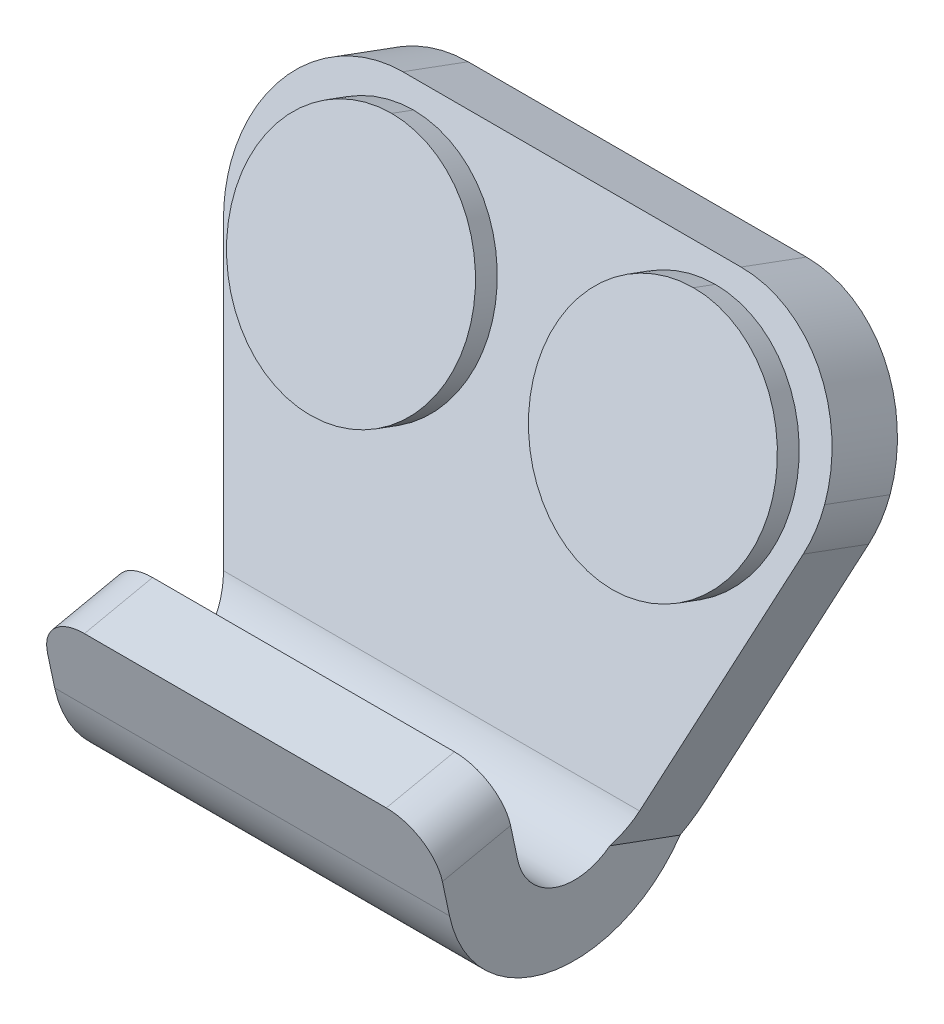
ISO-10303-21;
HEADER;
FILE_DESCRIPTION(('STEP AP214'),'2;1');
FILE_NAME('part.step','',(''),(''),'','','');
FILE_SCHEMA(('AUTOMOTIVE_DESIGN { 1 0 10303 214 1 1 1 1 }'));
ENDSEC;
DATA;
#1=APPLICATION_CONTEXT('core data for automotive mechanical design processes');
#2=APPLICATION_PROTOCOL_DEFINITION('international standard','automotive_design',2000,#1);
#3=PRODUCT_CONTEXT('',#1,'mechanical');
#4=PRODUCT('Part','Part','',(#3));
#5=PRODUCT_RELATED_PRODUCT_CATEGORY('part','',(#4));
#6=PRODUCT_DEFINITION_FORMATION('','',#4);
#7=PRODUCT_DEFINITION_CONTEXT('part definition',#1,'design');
#8=PRODUCT_DEFINITION('design','',#6,#7);
#9=PRODUCT_DEFINITION_SHAPE('','',#8);
#10=(LENGTH_UNIT() NAMED_UNIT(*) SI_UNIT(.MILLI.,.METRE.));
#11=(NAMED_UNIT(*) PLANE_ANGLE_UNIT() SI_UNIT($,.RADIAN.));
#12=(NAMED_UNIT(*) SI_UNIT($,.STERADIAN.) SOLID_ANGLE_UNIT());
#13=UNCERTAINTY_MEASURE_WITH_UNIT(LENGTH_MEASURE(1.E-05),#10,'distance_accuracy_value','');
#14=(GEOMETRIC_REPRESENTATION_CONTEXT(3) GLOBAL_UNCERTAINTY_ASSIGNED_CONTEXT((#13)) GLOBAL_UNIT_ASSIGNED_CONTEXT((#10,
#11,#12)) REPRESENTATION_CONTEXT('',''));
#15=CARTESIAN_POINT('',(0.,0.,0.));
#16=DIRECTION('',(0.,0.,1.));
#17=DIRECTION('',(1.,0.,0.));
#18=AXIS2_PLACEMENT_3D('',#15,#16,#17);
#19=CARTESIAN_POINT('',(-17.5228929671745,247.921551689117,306.539228223252));
#20=DIRECTION('',(0.,-0.345324030580384,-0.938483518184373));
#21=DIRECTION('',(0.,-0.938483518184373,0.345324030580384));
#22=AXIS2_PLACEMENT_3D('',#19,#20,#21);
#23=CYLINDRICAL_SURFACE('',#22,1.52002083154887);
#24=CARTESIAN_POINT('',(-17.5228929671745,247.921551689117,306.539228223252));
#25=DIRECTION('',(0.,0.345324030580384,0.938483518184373));
#26=DIRECTION('',(0.,0.938483518184373,-0.345324030580384));
#27=AXIS2_PLACEMENT_3D('',#24,#25,#26);
#28=CIRCLE('',#27,1.52002083154887);
#29=CARTESIAN_POINT('',(-17.5228929671745,249.348066186823,306.014328503135));
#30=VERTEX_POINT('',#29);
#31=CARTESIAN_POINT('',(-17.5228929671745,246.495037191412,307.064127943368));
#32=VERTEX_POINT('',#31);
#33=EDGE_CURVE('E63',#30,#32,#28,.T.);
#34=ORIENTED_EDGE('',*,*,#33,.F.);
#35=DIRECTION('',(0.,-0.345324030580384,-0.938483518184373));
#36=VECTOR('',#35,1.);
#37=CARTESIAN_POINT('',(-17.5228929671745,249.348066186823,306.014328503135));
#38=LINE('',#37,#36);
#39=CARTESIAN_POINT('',(-17.5228929671745,249.244468977648,305.73278344768));
#40=VERTEX_POINT('',#39);
#41=EDGE_CURVE('E11',#30,#40,#38,.T.);
#42=ORIENTED_EDGE('',*,*,#41,.T.);
#43=CARTESIAN_POINT('',(-17.5228929671745,247.817954479943,306.257683167796));
#44=DIRECTION('',(0.,0.345324030580384,0.938483518184373));
#45=DIRECTION('',(0.,0.938483518184373,-0.345324030580384));
#46=AXIS2_PLACEMENT_3D('',#43,#44,#45);
#47=CIRCLE('',#46,1.52002083154887);
#48=CARTESIAN_POINT('',(-17.5228929671745,246.391439982237,306.782582887913));
#49=VERTEX_POINT('',#48);
#50=EDGE_CURVE('E51',#40,#49,#47,.T.);
#51=ORIENTED_EDGE('',*,*,#50,.T.);
#52=DIRECTION('',(0.,-0.345324030580384,-0.938483518184373));
#53=VECTOR('',#52,1.);
#54=CARTESIAN_POINT('',(-17.5228929671745,246.495037191412,307.064127943368));
#55=LINE('',#54,#53);
#56=EDGE_CURVE('E424',#32,#49,#55,.T.);
#57=ORIENTED_EDGE('',*,*,#56,.F.);
#58=EDGE_LOOP('',(#34,#42,#51,#57));
#59=FACE_BOUND('',#58,.T.);
#60=ADVANCED_FACE('F40',(#59),#23,.T.);
#61=CARTESIAN_POINT('',(-21.4228929671745,247.921551689117,306.539228223252));
#62=DIRECTION('',(0.,-0.345324030580384,-0.938483518184373));
#63=DIRECTION('',(0.,-0.938483518184373,0.345324030580384));
#64=AXIS2_PLACEMENT_3D('',#61,#62,#63);
#65=CYLINDRICAL_SURFACE('',#64,1.52002083154887);
#66=CARTESIAN_POINT('',(-21.4228929671745,247.921551689117,306.539228223252));
#67=DIRECTION('',(0.,0.345324030580384,0.938483518184373));
#68=DIRECTION('',(0.,0.938483518184373,-0.345324030580384));
#69=AXIS2_PLACEMENT_3D('',#66,#67,#68);
#70=CIRCLE('',#69,1.52002083154887);
#71=CARTESIAN_POINT('',(-21.4228929671745,249.348066186823,306.014328503135));
#72=VERTEX_POINT('',#71);
#73=CARTESIAN_POINT('',(-21.4228929671745,246.495037191412,307.064127943368));
#74=VERTEX_POINT('',#73);
#75=EDGE_CURVE('E481',#72,#74,#70,.T.);
#76=ORIENTED_EDGE('',*,*,#75,.F.);
#77=DIRECTION('',(0.,-0.345324030580384,-0.938483518184373));
#78=VECTOR('',#77,1.);
#79=CARTESIAN_POINT('',(-21.4228929671745,249.348066186823,306.014328503135));
#80=LINE('',#79,#78);
#81=CARTESIAN_POINT('',(-21.4228929671745,249.244468977648,305.73278344768));
#82=VERTEX_POINT('',#81);
#83=EDGE_CURVE('E411',#72,#82,#80,.T.);
#84=ORIENTED_EDGE('',*,*,#83,.T.);
#85=CARTESIAN_POINT('',(-21.4228929671745,247.817954479943,306.257683167796));
#86=DIRECTION('',(0.,0.345324030580384,0.938483518184373));
#87=DIRECTION('',(0.,0.938483518184373,-0.345324030580384));
#88=AXIS2_PLACEMENT_3D('',#85,#86,#87);
#89=CIRCLE('',#88,1.52002083154887);
#90=CARTESIAN_POINT('',(-21.4228929671745,246.391439982237,306.782582887913));
#91=VERTEX_POINT('',#90);
#92=EDGE_CURVE('E407',#82,#91,#89,.T.);
#93=ORIENTED_EDGE('',*,*,#92,.T.);
#94=DIRECTION('',(0.,-0.345324030580384,-0.938483518184373));
#95=VECTOR('',#94,1.);
#96=CARTESIAN_POINT('',(-21.4228929671745,246.495037191412,307.064127943368));
#97=LINE('',#96,#95);
#98=EDGE_CURVE('E478',#74,#91,#97,.T.);
#99=ORIENTED_EDGE('',*,*,#98,.F.);
#100=EDGE_LOOP('',(#76,#84,#93,#99));
#101=FACE_BOUND('',#100,.T.);
#102=ADVANCED_FACE('F712',(#101),#65,.T.);
#103=CARTESIAN_POINT('',(-21.6578772935222,250.134268400327,312.118330727771));
#104=DIRECTION('',(0.,-0.345324030580384,-0.938483518184373));
#105=DIRECTION('',(-1.,0.,0.));
#106=AXIS2_PLACEMENT_3D('',#103,#104,#105);
#107=CYLINDRICAL_SURFACE('',#106,1.65);
#108=CARTESIAN_POINT('',(-21.6578772935222,247.958727007671,306.205884563209));
#109=DIRECTION('',(0.,-0.345324030580384,-0.938483518184373));
#110=DIRECTION('',(-1.,0.,0.));
#111=AXIS2_PLACEMENT_3D('',#108,#109,#110);
#112=CIRCLE('',#111,1.65);
#113=CARTESIAN_POINT('',(-23.2175872757407,247.453508309325,306.391784639084));
#114=VERTEX_POINT('',#113);
#115=CARTESIAN_POINT('',(-23.3078772935222,247.958727007671,306.205884563209));
#116=VERTEX_POINT('',#115);
#117=EDGE_CURVE('E344',#114,#116,#112,.T.);
#118=ORIENTED_EDGE('',*,*,#117,.T.);
#119=DIRECTION('',(0.,-0.345324030580384,-0.938483518184373));
#120=VECTOR('',#119,1.);
#121=CARTESIAN_POINT('',(-23.3078772935222,250.134268400327,312.118330727771));
#122=LINE('',#121,#120);
#123=CARTESIAN_POINT('',(-23.3078772935222,247.647935380148,305.361249396843));
#124=VERTEX_POINT('',#123);
#125=EDGE_CURVE('E340',#116,#124,#122,.T.);
#126=ORIENTED_EDGE('',*,*,#125,.T.);
#127=CARTESIAN_POINT('',(-21.6578772935222,247.647935380148,305.361249396843));
#128=DIRECTION('',(0.,-0.345324030580384,-0.938483518184373));
#129=DIRECTION('',(-1.,0.,0.));
#130=AXIS2_PLACEMENT_3D('',#127,#128,#129);
#131=CIRCLE('',#130,1.65);
#132=CARTESIAN_POINT('',(-23.2175872757407,247.142716681803,305.547149472718));
#133=VERTEX_POINT('',#132);
#134=EDGE_CURVE('E401',#133,#124,#131,.T.);
#135=ORIENTED_EDGE('',*,*,#134,.F.);
#136=DIRECTION('',(0.,0.345324030580384,0.938483518184373));
#137=VECTOR('',#136,1.);
#138=CARTESIAN_POINT('',(-23.2175872757407,249.629049701981,312.304230803645));
#139=LINE('',#138,#137);
#140=EDGE_CURVE('E345',#133,#114,#139,.T.);
#141=ORIENTED_EDGE('',*,*,#140,.T.);
#142=EDGE_LOOP('',(#118,#126,#135,#141));
#143=FACE_BOUND('',#142,.T.);
#144=ADVANCED_FACE('F716',(#143),#107,.T.);
#145=CARTESIAN_POINT('',(-17.2879086408268,245.472393987492,299.448803232282));
#146=DIRECTION('',(0.,0.345324030580384,0.938483518184373));
#147=DIRECTION('',(1.,0.,0.));
#148=AXIS2_PLACEMENT_3D('',#145,#146,#147);
#149=CYLINDRICAL_SURFACE('',#148,1.65);
#150=CARTESIAN_POINT('',(-17.2879086408268,247.647935380148,305.361249396843));
#151=DIRECTION('',(0.,-0.345324030580384,-0.938483518184373));
#152=DIRECTION('',(1.,0.,0.));
#153=AXIS2_PLACEMENT_3D('',#150,#151,#152);
#154=CIRCLE('',#153,1.65);
#155=CARTESIAN_POINT('',(-15.6379086408268,247.647935380148,305.361249396843));
#156=VERTEX_POINT('',#155);
#157=CARTESIAN_POINT('',(-15.7281986586084,247.142716681803,305.547149472718));
#158=VERTEX_POINT('',#157);
#159=EDGE_CURVE('E356',#156,#158,#154,.T.);
#160=ORIENTED_EDGE('',*,*,#159,.F.);
#161=DIRECTION('',(0.,0.345324030580384,0.938483518184373));
#162=VECTOR('',#161,1.);
#163=CARTESIAN_POINT('',(-15.6379086408268,245.472393987492,299.448803232282));
#164=LINE('',#163,#162);
#165=CARTESIAN_POINT('',(-15.6379086408268,247.958727007671,306.205884563209));
#166=VERTEX_POINT('',#165);
#167=EDGE_CURVE('E490',#156,#166,#164,.T.);
#168=ORIENTED_EDGE('',*,*,#167,.T.);
#169=CARTESIAN_POINT('',(-17.2879086408268,247.958727007671,306.205884563209));
#170=DIRECTION('',(0.,-0.345324030580384,-0.938483518184373));
#171=DIRECTION('',(1.,0.,0.));
#172=AXIS2_PLACEMENT_3D('',#169,#170,#171);
#173=CIRCLE('',#172,1.65);
#174=CARTESIAN_POINT('',(-15.7281986586084,247.453508309325,306.391784639084));
#175=VERTEX_POINT('',#174);
#176=EDGE_CURVE('E494',#166,#175,#173,.T.);
#177=ORIENTED_EDGE('',*,*,#176,.T.);
#178=DIRECTION('',(0.,-0.345324030580384,-0.938483518184373));
#179=VECTOR('',#178,1.);
#180=CARTESIAN_POINT('',(-15.7281986586084,248.385883191892,308.925690138181));
#181=LINE('',#180,#179);
#182=EDGE_CURVE('E272',#175,#158,#181,.T.);
#183=ORIENTED_EDGE('',*,*,#182,.T.);
#184=EDGE_LOOP('',(#160,#168,#177,#183));
#185=FACE_BOUND('',#184,.T.);
#186=ADVANCED_FACE('F733',(#185),#149,.T.);
#187=CARTESIAN_POINT('',(-17.5228929671745,247.507162852421,305.41304800143));
#188=DIRECTION('',(0.,0.345324030580384,0.938483518184373));
#189=DIRECTION('',(0.,0.938483518184373,-0.345324030580384));
#190=AXIS2_PLACEMENT_3D('',#187,#188,#189);
#191=CYLINDRICAL_SURFACE('',#190,0.795);
#192=CARTESIAN_POINT('',(-17.5228929671745,247.507162852421,305.41304800143));
#193=DIRECTION('',(0.,0.345324030580384,0.938483518184373));
#194=DIRECTION('',(0.,0.938483518184373,-0.345324030580384));
#195=AXIS2_PLACEMENT_3D('',#192,#193,#194);
#196=CIRCLE('',#195,0.795);
#197=CARTESIAN_POINT('',(-17.5228929671745,246.761068455464,305.687580605742));
#198=VERTEX_POINT('',#197);
#199=CARTESIAN_POINT('',(-17.5228929671745,248.253257249377,305.138515397119));
#200=VERTEX_POINT('',#199);
#201=EDGE_CURVE('E338',#198,#200,#196,.T.);
#202=ORIENTED_EDGE('',*,*,#201,.F.);
#203=DIRECTION('',(0.,0.345324030580384,0.938483518184373));
#204=VECTOR('',#203,1.);
#205=CARTESIAN_POINT('',(-17.5228929671745,246.761068455464,305.687580605742));
#206=LINE('',#205,#204);
#207=CARTESIAN_POINT('',(-17.5228929671745,246.824935390554,305.861151109476));
#208=VERTEX_POINT('',#207);
#209=EDGE_CURVE('E402',#198,#208,#206,.T.);
#210=ORIENTED_EDGE('',*,*,#209,.T.);
#211=CARTESIAN_POINT('',(-17.5228929671745,247.571029787511,305.586618505164));
#212=DIRECTION('',(0.,-0.345324030580384,-0.938483518184373));
#213=DIRECTION('',(0.,0.938483518184373,-0.345324030580384));
#214=AXIS2_PLACEMENT_3D('',#211,#212,#213);
#215=CIRCLE('',#214,0.795);
#216=CARTESIAN_POINT('',(-17.5228929671745,248.317124184468,305.312085900853));
#217=VERTEX_POINT('',#216);
#218=EDGE_CURVE('E441',#217,#208,#215,.T.);
#219=ORIENTED_EDGE('',*,*,#218,.F.);
#220=DIRECTION('',(0.,0.345324030580384,0.938483518184373));
#221=VECTOR('',#220,1.);
#222=CARTESIAN_POINT('',(-17.5228929671745,248.253257249377,305.138515397119));
#223=LINE('',#222,#221);
#224=EDGE_CURVE('E303',#200,#217,#223,.T.);
#225=ORIENTED_EDGE('',*,*,#224,.F.);
#226=EDGE_LOOP('',(#202,#210,#219,#225));
#227=FACE_BOUND('',#226,.T.);
#228=ADVANCED_FACE('F42',(#227),#191,.F.);
#229=CARTESIAN_POINT('',(-21.4228929671745,247.507162852421,305.41304800143));
#230=DIRECTION('',(0.,0.345324030580384,0.938483518184373));
#231=DIRECTION('',(0.,0.938483518184373,-0.345324030580384));
#232=AXIS2_PLACEMENT_3D('',#229,#230,#231);
#233=CYLINDRICAL_SURFACE('',#232,0.795);
#234=CARTESIAN_POINT('',(-21.4228929671745,247.507162852421,305.41304800143));
#235=DIRECTION('',(0.,0.345324030580384,0.938483518184373));
#236=DIRECTION('',(0.,0.938483518184373,-0.345324030580384));
#237=AXIS2_PLACEMENT_3D('',#234,#235,#236);
#238=CIRCLE('',#237,0.795);
#239=CARTESIAN_POINT('',(-21.4228929671745,246.761068455464,305.687580605742));
#240=VERTEX_POINT('',#239);
#241=CARTESIAN_POINT('',(-21.4228929671745,248.253257249377,305.138515397119));
#242=VERTEX_POINT('',#241);
#243=EDGE_CURVE('E339',#240,#242,#238,.T.);
#244=ORIENTED_EDGE('',*,*,#243,.F.);
#245=DIRECTION('',(0.,0.345324030580384,0.938483518184373));
#246=VECTOR('',#245,1.);
#247=CARTESIAN_POINT('',(-21.4228929671745,246.761068455464,305.687580605742));
#248=LINE('',#247,#246);
#249=CARTESIAN_POINT('',(-21.4228929671745,246.824935390554,305.861151109476));
#250=VERTEX_POINT('',#249);
#251=EDGE_CURVE('E406',#240,#250,#248,.T.);
#252=ORIENTED_EDGE('',*,*,#251,.T.);
#253=CARTESIAN_POINT('',(-21.4228929671745,247.571029787511,305.586618505164));
#254=DIRECTION('',(0.,-0.345324030580384,-0.938483518184373));
#255=DIRECTION('',(0.,0.938483518184373,-0.345324030580384));
#256=AXIS2_PLACEMENT_3D('',#253,#254,#255);
#257=CIRCLE('',#256,0.795);
#258=CARTESIAN_POINT('',(-21.4228929671745,248.317124184468,305.312085900853));
#259=VERTEX_POINT('',#258);
#260=EDGE_CURVE('E428',#259,#250,#257,.T.);
#261=ORIENTED_EDGE('',*,*,#260,.F.);
#262=DIRECTION('',(0.,0.345324030580384,0.938483518184373));
#263=VECTOR('',#262,1.);
#264=CARTESIAN_POINT('',(-21.4228929671745,248.253257249377,305.138515397119));
#265=LINE('',#264,#263);
#266=EDGE_CURVE('E297',#242,#259,#265,.T.);
#267=ORIENTED_EDGE('',*,*,#266,.F.);
#268=EDGE_LOOP('',(#244,#252,#261,#267));
#269=FACE_BOUND('',#268,.T.);
#270=ADVANCED_FACE('F792',(#269),#233,.F.);
#271=CARTESIAN_POINT('',(-17.5228929671745,247.817954479936,306.257683167776));
#272=DIRECTION('',(0.,0.345324030580384,0.938483518184373));
#273=DIRECTION('',(0.,0.938483518184373,-0.345324030580384));
#274=AXIS2_PLACEMENT_3D('',#271,#272,#273);
#275=CONICAL_SURFACE('',#274,1.3949999999988,0.698131700800517);
#276=ORIENTED_EDGE('',*,*,#218,.T.);
#277=DIRECTION('',(0.,-0.338712022685016,0.94089009224703));
#278=VECTOR('',#277,1.);
#279=CARTESIAN_POINT('',(-17.5228929671745,246.50876997207,306.739410190436));
#280=LINE('',#279,#278);
#281=CARTESIAN_POINT('',(-17.5228929671745,246.508769972054,306.739410190478));
#282=VERTEX_POINT('',#281);
#283=EDGE_CURVE('E431',#208,#282,#280,.T.);
#284=ORIENTED_EDGE('',*,*,#283,.T.);
#285=CARTESIAN_POINT('',(-17.5228929671745,247.817954479947,306.257683167808));
#286=DIRECTION('',(0.,-0.345324030580384,-0.938483518184373));
#287=DIRECTION('',(0.,0.938483518184373,-0.345324030580384));
#288=AXIS2_PLACEMENT_3D('',#285,#286,#287);
#289=CIRCLE('',#288,1.39500000002742);
#290=CARTESIAN_POINT('',(-17.5228929671745,249.12713898784,305.775956145139));
#291=VERTEX_POINT('',#290);
#292=EDGE_CURVE('E419',#291,#282,#289,.T.);
#293=ORIENTED_EDGE('',*,*,#292,.F.);
#294=DIRECTION('',(0.,0.867779132086882,0.496950075877384));
#295=VECTOR('',#294,1.);
#296=CARTESIAN_POINT('',(-17.5228929671745,249.127138987802,305.775956145117));
#297=LINE('',#296,#295);
#298=EDGE_CURVE('E472',#217,#291,#297,.T.);
#299=ORIENTED_EDGE('',*,*,#298,.F.);
#300=EDGE_LOOP('',(#276,#284,#293,#299));
#301=FACE_BOUND('',#300,.T.);
#302=ADVANCED_FACE('F788',(#301),#275,.F.);
#303=CARTESIAN_POINT('',(-21.4228929671745,247.817954479936,306.257683167776));
#304=DIRECTION('',(0.,0.345324030580384,0.938483518184373));
#305=DIRECTION('',(0.,0.938483518184373,-0.345324030580384));
#306=AXIS2_PLACEMENT_3D('',#303,#304,#305);
#307=CONICAL_SURFACE('',#306,1.39499999999184,0.698131700800517);
#308=ORIENTED_EDGE('',*,*,#260,.T.);
#309=DIRECTION('',(0.,-0.338712022685016,0.94089009224703));
#310=VECTOR('',#309,1.);
#311=CARTESIAN_POINT('',(-21.4228929671745,246.508769972076,306.739410190433));
#312=LINE('',#311,#310);
#313=CARTESIAN_POINT('',(-21.4228929671745,246.508769972061,306.739410190475));
#314=VERTEX_POINT('',#313);
#315=EDGE_CURVE('E432',#250,#314,#312,.T.);
#316=ORIENTED_EDGE('',*,*,#315,.T.);
#317=CARTESIAN_POINT('',(-21.4228929671745,247.817954479947,306.257683167808));
#318=DIRECTION('',(0.,-0.345324030580384,-0.938483518184373));
#319=DIRECTION('',(0.,0.938483518184373,-0.345324030580384));
#320=AXIS2_PLACEMENT_3D('',#317,#318,#319);
#321=CIRCLE('',#320,1.39500000002046);
#322=CARTESIAN_POINT('',(-21.4228929671745,249.127138987834,305.775956145142));
#323=VERTEX_POINT('',#322);
#324=EDGE_CURVE('E323',#323,#314,#321,.T.);
#325=ORIENTED_EDGE('',*,*,#324,.F.);
#326=DIRECTION('',(0.,0.867779132086882,0.496950075877384));
#327=VECTOR('',#326,1.);
#328=CARTESIAN_POINT('',(-21.4228929671745,249.127138987795,305.77595614512));
#329=LINE('',#328,#327);
#330=EDGE_CURVE('E374',#259,#323,#329,.T.);
#331=ORIENTED_EDGE('',*,*,#330,.F.);
#332=EDGE_LOOP('',(#308,#316,#325,#331));
#333=FACE_BOUND('',#332,.T.);
#334=ADVANCED_FACE('F781',(#333),#307,.F.);
#335=CARTESIAN_POINT('',(-14.9728929671745,249.196433185153,304.791464746386));
#336=DIRECTION('',(0.,-0.345324030580384,-0.938483518184373));
#337=DIRECTION('',(-1.,0.,0.));
#338=AXIS2_PLACEMENT_3D('',#335,#336,#337);
#339=PLANE('',#338);
#340=ORIENTED_EDGE('',*,*,#134,.T.);
#341=CARTESIAN_POINT('',(-21.6578772935222,247.647935380148,305.361249396843));
#342=DIRECTION('',(0.,-0.345324030580384,-0.938483518184373));
#343=DIRECTION('',(-1.,0.,0.));
#344=AXIS2_PLACEMENT_3D('',#341,#342,#343);
#345=CIRCLE('',#344,1.65);
#346=CARTESIAN_POINT('',(-21.6578772935222,249.196433185153,304.791464746386));
#347=VERTEX_POINT('',#346);
#348=EDGE_CURVE('E332',#124,#347,#345,.T.);
#349=ORIENTED_EDGE('',*,*,#348,.T.);
#350=DIRECTION('',(1.,0.,0.));
#351=VECTOR('',#350,1.);
#352=CARTESIAN_POINT('',(-14.9728929671745,249.196433185153,304.791464746386));
#353=LINE('',#352,#351);
#354=CARTESIAN_POINT('',(-17.2879086408268,249.196433185153,304.791464746386));
#355=VERTEX_POINT('',#354);
#356=EDGE_CURVE('E328',#347,#355,#353,.T.);
#357=ORIENTED_EDGE('',*,*,#356,.T.);
#358=CARTESIAN_POINT('',(-17.2879086408268,247.647935380148,305.361249396843));
#359=DIRECTION('',(0.,-0.345324030580384,-0.938483518184373));
#360=DIRECTION('',(1.,0.,0.));
#361=AXIS2_PLACEMENT_3D('',#358,#359,#360);
#362=CIRCLE('',#361,1.65);
#363=EDGE_CURVE('E333',#355,#156,#362,.T.);
#364=ORIENTED_EDGE('',*,*,#363,.T.);
#365=ORIENTED_EDGE('',*,*,#159,.T.);
#366=DIRECTION('',(-0.326263748461914,-0.88712855239977,0.326427477330983));
#367=VECTOR('',#366,1.);
#368=CARTESIAN_POINT('',(-15.7281986586084,247.142716681803,305.547149472718));
#369=LINE('',#368,#367);
#370=CARTESIAN_POINT('',(-16.7849347911497,244.269394714685,306.604415906933));
#371=VERTEX_POINT('',#370);
#372=EDGE_CURVE('E352',#158,#371,#369,.T.);
#373=ORIENTED_EDGE('',*,*,#372,.T.);
#374=DIRECTION('',(-1.,0.,0.));
#375=VECTOR('',#374,1.);
#376=CARTESIAN_POINT('',(-14.9728929671745,244.269394714685,306.604415906933));
#377=LINE('',#376,#375);
#378=CARTESIAN_POINT('',(-22.1608511431994,244.269394714685,306.604415906933));
#379=VERTEX_POINT('',#378);
#380=EDGE_CURVE('E357',#371,#379,#377,.T.);
#381=ORIENTED_EDGE('',*,*,#380,.T.);
#382=DIRECTION('',(-0.32626374846192,0.887128552399768,-0.326427477330981));
#383=VECTOR('',#382,1.);
#384=CARTESIAN_POINT('',(-22.1608511431994,244.269394714685,306.604415906933));
#385=LINE('',#384,#383);
#386=EDGE_CURVE('E362',#379,#133,#385,.T.);
#387=ORIENTED_EDGE('',*,*,#386,.T.);
#388=EDGE_LOOP('',(#340,#349,#357,#364,#365,#373,#381,#387));
#389=FACE_BOUND('',#388,.T.);
#390=CARTESIAN_POINT('',(-17.5228929671745,247.507162852421,305.41304800143));
#391=DIRECTION('',(0.,0.345324030580384,0.938483518184373));
#392=DIRECTION('',(0.,0.938483518184373,-0.345324030580384));
#393=AXIS2_PLACEMENT_3D('',#390,#391,#392);
#394=CIRCLE('',#393,0.795);
#395=EDGE_CURVE('E358',#200,#198,#394,.T.);
#396=ORIENTED_EDGE('',*,*,#395,.T.);
#397=ORIENTED_EDGE('',*,*,#201,.T.);
#398=EDGE_LOOP('',(#396,#397));
#399=FACE_BOUND('',#398,.T.);
#400=CARTESIAN_POINT('',(-21.4228929671745,247.507162852421,305.41304800143));
#401=DIRECTION('',(0.,0.345324030580384,0.938483518184373));
#402=DIRECTION('',(0.,0.938483518184373,-0.345324030580384));
#403=AXIS2_PLACEMENT_3D('',#400,#401,#402);
#404=CIRCLE('',#403,0.795);
#405=EDGE_CURVE('E334',#242,#240,#404,.T.);
#406=ORIENTED_EDGE('',*,*,#405,.T.);
#407=ORIENTED_EDGE('',*,*,#243,.T.);
#408=EDGE_LOOP('',(#406,#407));
#409=FACE_BOUND('',#408,.T.);
#410=ADVANCED_FACE('F696',(#389,#399,#409),#339,.T.);
#411=CARTESIAN_POINT('',(-14.9728929671745,249.507224812675,305.636099912752));
#412=DIRECTION('',(0.,0.938483518184373,-0.345324030580384));
#413=DIRECTION('',(0.,0.345324030580384,0.938483518184373));
#414=AXIS2_PLACEMENT_3D('',#411,#412,#413);
#415=PLANE('',#414);
#416=DIRECTION('',(0.,0.345324030580384,0.938483518184373));
#417=VECTOR('',#416,1.);
#418=CARTESIAN_POINT('',(-21.6578772935222,249.507224812675,305.636099912752));
#419=LINE('',#418,#417);
#420=CARTESIAN_POINT('',(-21.6578772935222,249.507224812675,305.636099912752));
#421=VERTEX_POINT('',#420);
#422=EDGE_CURVE('E321',#347,#421,#419,.T.);
#423=ORIENTED_EDGE('',*,*,#422,.T.);
#424=DIRECTION('',(1.,0.,0.));
#425=VECTOR('',#424,1.);
#426=CARTESIAN_POINT('',(-14.9728929671745,249.507224812675,305.636099912752));
#427=LINE('',#426,#425);
#428=CARTESIAN_POINT('',(-17.2879086408268,249.507224812675,305.636099912752));
#429=VERTEX_POINT('',#428);
#430=EDGE_CURVE('E317',#421,#429,#427,.T.);
#431=ORIENTED_EDGE('',*,*,#430,.T.);
#432=DIRECTION('',(0.,-0.345324030580384,-0.938483518184373));
#433=VECTOR('',#432,1.);
#434=CARTESIAN_POINT('',(-17.2879086408268,249.507224812675,305.636099912752));
#435=LINE('',#434,#433);
#436=EDGE_CURVE('E322',#429,#355,#435,.T.);
#437=ORIENTED_EDGE('',*,*,#436,.T.);
#438=ORIENTED_EDGE('',*,*,#356,.F.);
#439=EDGE_LOOP('',(#423,#431,#437,#438));
#440=FACE_BOUND('',#439,.T.);
#441=ADVANCED_FACE('F691',(#440),#415,.T.);
#442=CARTESIAN_POINT('',(-21.6578772935222,250.134268400327,312.118330727771));
#443=DIRECTION('',(0.,-0.345324030580384,-0.938483518184373));
#444=DIRECTION('',(-1.,0.,0.));
#445=AXIS2_PLACEMENT_3D('',#442,#443,#444);
#446=CYLINDRICAL_SURFACE('',#445,1.65);
#447=ORIENTED_EDGE('',*,*,#125,.F.);
#448=CARTESIAN_POINT('',(-21.6578772935222,247.958727007671,306.205884563209));
#449=DIRECTION('',(0.,-0.345324030580384,-0.938483518184373));
#450=DIRECTION('',(-1.,0.,0.));
#451=AXIS2_PLACEMENT_3D('',#448,#449,#450);
#452=CIRCLE('',#451,1.65);
#453=EDGE_CURVE('E365',#116,#421,#452,.T.);
#454=ORIENTED_EDGE('',*,*,#453,.T.);
#455=ORIENTED_EDGE('',*,*,#422,.F.);
#456=ORIENTED_EDGE('',*,*,#348,.F.);
#457=EDGE_LOOP('',(#447,#454,#455,#456));
#458=FACE_BOUND('',#457,.T.);
#459=ADVANCED_FACE('F695',(#458),#446,.T.);
#460=CARTESIAN_POINT('',(-23.9728929671745,250.439599695242,308.17000541185));
#461=DIRECTION('',(0.945278777102068,0.306193150512559,-0.112666712651135));
#462=DIRECTION('',(0.,-0.345324030580384,-0.938483518184373));
#463=AXIS2_PLACEMENT_3D('',#460,#461,#462);
#464=PLANE('',#463);
#465=ORIENTED_EDGE('',*,*,#386,.F.);
#466=CARTESIAN_POINT('',(-22.0228929671745,243.911250022314,306.788565100065));
#467=CARTESIAN_POINT('',(-22.0680704266981,244.022804305978,306.712694100358));
#468=CARTESIAN_POINT('',(-22.1142867704966,244.142783699076,306.651003647025));
#469=CARTESIAN_POINT('',(-22.1608511431994,244.269394714685,306.604415906933));
#470=(BOUNDED_CURVE() B_SPLINE_CURVE(3,(#466,#467,#468,#469),.UNSPECIFIED.,.F.,
.F.) B_SPLINE_CURVE_WITH_KNOTS((4,4),(4.46771001133095,4.71238898038469),
.UNSPECIFIED.) CURVE() GEOMETRIC_REPRESENTATION_ITEM() RATIONAL_B_SPLINE_CURVE((1.,
0.995017236226578,0.995017236226578,1.)) REPRESENTATION_ITEM(''));
#471=CARTESIAN_POINT('',(-22.0228929671745,243.911250022314,306.788565100065));
#472=VERTEX_POINT('',#471);
#473=EDGE_CURVE('E427',#472,#379,#470,.T.);
#474=ORIENTED_EDGE('',*,*,#473,.F.);
#475=DIRECTION('',(0.,-0.345324030580384,-0.938483518184373));
#476=VECTOR('',#475,1.);
#477=CARTESIAN_POINT('',(-22.0228929671745,245.137445578106,310.120983979944));
#478=LINE('',#477,#476);
#479=CARTESIAN_POINT('',(-22.0228929671745,244.24491577599,307.695365040637));
#480=VERTEX_POINT('',#479);
#481=EDGE_CURVE('E44',#480,#472,#478,.T.);
#482=ORIENTED_EDGE('',*,*,#481,.F.);
#483=CARTESIAN_POINT('',(-22.0228929671745,244.24491577599,307.695365040637));
#484=CARTESIAN_POINT('',(-22.0644808022734,244.331788632397,307.582534693427));
#485=CARTESIAN_POINT('',(-22.1117018835371,244.446546880939,307.498224997524));
#486=CARTESIAN_POINT('',(-22.1608511431994,244.580186342207,307.449051073299));
#487=(BOUNDED_CURVE() B_SPLINE_CURVE(3,(#483,#484,#485,#486),.UNSPECIFIED.,.F.,
.F.) B_SPLINE_CURVE_WITH_KNOTS((4,4),(1.00872652378927,1.5707963267949),
.UNSPECIFIED.) CURVE() GEOMETRIC_REPRESENTATION_ITEM() RATIONAL_B_SPLINE_CURVE((1.,
0.973845948553682,0.973845948553682,1.)) REPRESENTATION_ITEM(''));
#488=CARTESIAN_POINT('',(-22.1608511431994,244.580186342207,307.449051073299));
#489=VERTEX_POINT('',#488);
#490=EDGE_CURVE('E350',#480,#489,#487,.T.);
#491=ORIENTED_EDGE('',*,*,#490,.T.);
#492=DIRECTION('',(0.326263748461916,-0.88712855239977,0.326427477330982));
#493=VECTOR('',#492,1.);
#494=CARTESIAN_POINT('',(-23.9728929671745,249.507224812675,305.636099912752));
#495=LINE('',#494,#493);
#496=EDGE_CURVE('E278',#114,#489,#495,.T.);
#497=ORIENTED_EDGE('',*,*,#496,.F.);
#498=ORIENTED_EDGE('',*,*,#140,.F.);
#499=EDGE_LOOP('',(#465,#474,#482,#491,#497,#498));
#500=FACE_BOUND('',#499,.T.);
#501=ADVANCED_FACE('F622',(#500),#464,.F.);
#502=CARTESIAN_POINT('',(-14.9728929671745,244.839179365142,308.152913711937));
#503=DIRECTION('',(-1.,0.,0.));
#504=DIRECTION('',(0.,0.345324030580384,0.938483518184373));
#505=AXIS2_PLACEMENT_3D('',#502,#503,#504);
#506=CYLINDRICAL_SURFACE('',#505,1.65);
#507=CARTESIAN_POINT('',(-16.9228929671745,244.839179365142,308.152913711937));
#508=DIRECTION('',(-1.,0.,0.));
#509=DIRECTION('',(0.,0.345324030580384,0.938483518184373));
#510=AXIS2_PLACEMENT_3D('',#507,#508,#509);
#511=CIRCLE('',#510,1.65);
#512=CARTESIAN_POINT('',(-16.9228929671745,243.911250022314,306.788565100065));
#513=VERTEX_POINT('',#512);
#514=CARTESIAN_POINT('',(-16.9228929671745,244.496050415937,309.766841382007));
#515=VERTEX_POINT('',#514);
#516=EDGE_CURVE('E346',#513,#515,#511,.T.);
#517=ORIENTED_EDGE('',*,*,#516,.T.);
#518=DIRECTION('',(-1.,0.,0.));
#519=VECTOR('',#518,1.);
#520=CARTESIAN_POINT('',(-14.9728929671745,244.496050415937,309.766841382007));
#521=LINE('',#520,#519);
#522=CARTESIAN_POINT('',(-22.0228929671745,244.496050415937,309.766841382007));
#523=VERTEX_POINT('',#522);
#524=EDGE_CURVE('E351',#515,#523,#521,.T.);
#525=ORIENTED_EDGE('',*,*,#524,.T.);
#526=CARTESIAN_POINT('',(-22.0228929671745,244.839179365142,308.152913711937));
#527=DIRECTION('',(1.,0.,0.));
#528=DIRECTION('',(0.,0.345324030580385,0.938483518184373));
#529=AXIS2_PLACEMENT_3D('',#526,#527,#528);
#530=CIRCLE('',#529,1.65);
#531=EDGE_CURVE('E397',#523,#472,#530,.T.);
#532=ORIENTED_EDGE('',*,*,#531,.T.);
#533=ORIENTED_EDGE('',*,*,#473,.T.);
#534=ORIENTED_EDGE('',*,*,#380,.F.);
#535=CARTESIAN_POINT('',(-16.7849347911497,244.269394714685,306.604415906933));
#536=CARTESIAN_POINT('',(-16.8314991638524,244.142783699076,306.651003647025));
#537=CARTESIAN_POINT('',(-16.877715507651,244.022804305978,306.712694100358));
#538=CARTESIAN_POINT('',(-16.9228929671745,243.911250022314,306.788565100065));
#539=(BOUNDED_CURVE() B_SPLINE_CURVE(3,(#535,#536,#537,#538),.UNSPECIFIED.,.F.,
.F.) B_SPLINE_CURVE_WITH_KNOTS((4,4),(4.71238898038469,4.95706794943843),
.UNSPECIFIED.) CURVE() GEOMETRIC_REPRESENTATION_ITEM() RATIONAL_B_SPLINE_CURVE((1.,
0.995017236226578,0.995017236226578,1.)) REPRESENTATION_ITEM(''));
#540=EDGE_CURVE('E288',#371,#513,#539,.T.);
#541=ORIENTED_EDGE('',*,*,#540,.T.);
#542=EDGE_LOOP('',(#517,#525,#532,#533,#534,#541));
#543=FACE_BOUND('',#542,.T.);
#544=ADVANCED_FACE('F600',(#543),#506,.T.);
#545=CARTESIAN_POINT('',(-16.9228929671745,245.137445578106,310.120983979944));
#546=DIRECTION('',(-0.945278777102068,0.306193150512559,-0.112666712651131));
#547=DIRECTION('',(0.,0.345324030580384,0.938483518184373));
#548=AXIS2_PLACEMENT_3D('',#545,#546,#547);
#549=PLANE('',#548);
#550=DIRECTION('',(0.326263748461914,0.88712855239977,-0.326427477330983));
#551=VECTOR('',#550,1.);
#552=CARTESIAN_POINT('',(-16.9228929671745,244.205070695539,307.587078480846));
#553=LINE('',#552,#551);
#554=CARTESIAN_POINT('',(-16.7849347911497,244.580186342207,307.449051073299));
#555=VERTEX_POINT('',#554);
#556=EDGE_CURVE('E264',#555,#175,#553,.T.);
#557=ORIENTED_EDGE('',*,*,#556,.F.);
#558=CARTESIAN_POINT('',(-16.7849347911497,244.580186342207,307.449051073299));
#559=CARTESIAN_POINT('',(-16.834084050812,244.446546880939,307.498224997524));
#560=CARTESIAN_POINT('',(-16.8813051320757,244.331788632397,307.582534693427));
#561=CARTESIAN_POINT('',(-16.9228929671745,244.24491577599,307.695365040637));
#562=(BOUNDED_CURVE() B_SPLINE_CURVE(3,(#558,#559,#560,#561),.UNSPECIFIED.,.F.,
.F.) B_SPLINE_CURVE_WITH_KNOTS((4,4),(1.5707963267949,2.13286612980053),
.UNSPECIFIED.) CURVE() GEOMETRIC_REPRESENTATION_ITEM() RATIONAL_B_SPLINE_CURVE((1.,
0.973845948553681,0.973845948553681,1.)) REPRESENTATION_ITEM(''));
#563=CARTESIAN_POINT('',(-16.9228929671745,244.24491577599,307.695365040637));
#564=VERTEX_POINT('',#563);
#565=EDGE_CURVE('E268',#555,#564,#562,.T.);
#566=ORIENTED_EDGE('',*,*,#565,.T.);
#567=DIRECTION('',(0.,0.345324030580384,0.938483518184373));
#568=VECTOR('',#567,1.);
#569=CARTESIAN_POINT('',(-16.9228929671745,245.137445578106,310.120983979944));
#570=LINE('',#569,#568);
#571=EDGE_CURVE('E471',#513,#564,#570,.T.);
#572=ORIENTED_EDGE('',*,*,#571,.F.);
#573=ORIENTED_EDGE('',*,*,#540,.F.);
#574=ORIENTED_EDGE('',*,*,#372,.F.);
#575=ORIENTED_EDGE('',*,*,#182,.F.);
#576=EDGE_LOOP('',(#557,#566,#572,#573,#574,#575));
#577=FACE_BOUND('',#576,.T.);
#578=ADVANCED_FACE('F266',(#577),#549,.F.);
#579=CARTESIAN_POINT('',(-17.2879086408268,245.472393987492,299.448803232282));
#580=DIRECTION('',(0.,0.345324030580384,0.938483518184373));
#581=DIRECTION('',(1.,0.,0.));
#582=AXIS2_PLACEMENT_3D('',#579,#580,#581);
#583=CYLINDRICAL_SURFACE('',#582,1.65);
#584=ORIENTED_EDGE('',*,*,#167,.F.);
#585=ORIENTED_EDGE('',*,*,#363,.F.);
#586=ORIENTED_EDGE('',*,*,#436,.F.);
#587=CARTESIAN_POINT('',(-17.2879086408268,247.958727007671,306.205884563209));
#588=DIRECTION('',(0.,-0.345324030580384,-0.938483518184373));
#589=DIRECTION('',(1.,0.,0.));
#590=AXIS2_PLACEMENT_3D('',#587,#588,#589);
#591=CIRCLE('',#590,1.65);
#592=EDGE_CURVE('E289',#429,#166,#591,.T.);
#593=ORIENTED_EDGE('',*,*,#592,.T.);
#594=EDGE_LOOP('',(#584,#585,#586,#593));
#595=FACE_BOUND('',#594,.T.);
#596=ADVANCED_FACE('F802',(#595),#583,.T.);
#597=CARTESIAN_POINT('',(-17.5228929671745,247.507162852421,305.41304800143));
#598=DIRECTION('',(0.,0.345324030580384,0.938483518184373));
#599=DIRECTION('',(0.,0.938483518184373,-0.345324030580384));
#600=AXIS2_PLACEMENT_3D('',#597,#598,#599);
#601=CYLINDRICAL_SURFACE('',#600,0.795);
#602=ORIENTED_EDGE('',*,*,#209,.F.);
#603=ORIENTED_EDGE('',*,*,#395,.F.);
#604=ORIENTED_EDGE('',*,*,#224,.T.);
#605=CARTESIAN_POINT('',(-17.5228929671745,247.571029787511,305.586618505164));
#606=DIRECTION('',(0.,-0.345324030580384,-0.938483518184373));
#607=DIRECTION('',(0.,0.938483518184373,-0.345324030580384));
#608=AXIS2_PLACEMENT_3D('',#605,#606,#607);
#609=CIRCLE('',#608,0.795);
#610=EDGE_CURVE('E467',#208,#217,#609,.T.);
#611=ORIENTED_EDGE('',*,*,#610,.F.);
#612=EDGE_LOOP('',(#602,#603,#604,#611));
#613=FACE_BOUND('',#612,.T.);
#614=ADVANCED_FACE('F853',(#613),#601,.F.);
#615=CARTESIAN_POINT('',(-21.4228929671745,247.507162852421,305.41304800143));
#616=DIRECTION('',(0.,0.345324030580384,0.938483518184373));
#617=DIRECTION('',(0.,0.938483518184373,-0.345324030580384));
#618=AXIS2_PLACEMENT_3D('',#615,#616,#617);
#619=CYLINDRICAL_SURFACE('',#618,0.795);
#620=ORIENTED_EDGE('',*,*,#251,.F.);
#621=ORIENTED_EDGE('',*,*,#405,.F.);
#622=ORIENTED_EDGE('',*,*,#266,.T.);
#623=CARTESIAN_POINT('',(-21.4228929671745,247.571029787511,305.586618505164));
#624=DIRECTION('',(0.,-0.345324030580384,-0.938483518184373));
#625=DIRECTION('',(0.,0.938483518184373,-0.345324030580384));
#626=AXIS2_PLACEMENT_3D('',#623,#624,#625);
#627=CIRCLE('',#626,0.795);
#628=EDGE_CURVE('E306',#250,#259,#627,.T.);
#629=ORIENTED_EDGE('',*,*,#628,.F.);
#630=EDGE_LOOP('',(#620,#621,#622,#629));
#631=FACE_BOUND('',#630,.T.);
#632=ADVANCED_FACE('F630',(#631),#619,.F.);
#633=CARTESIAN_POINT('',(-14.9728929671745,244.580186342207,307.449051073299));
#634=DIRECTION('',(0.,0.345324030580384,0.938483518184373));
#635=DIRECTION('',(-1.,0.,0.));
#636=AXIS2_PLACEMENT_3D('',#633,#634,#635);
#637=PLANE('',#636);
#638=DIRECTION('',(1.,0.,0.));
#639=VECTOR('',#638,1.);
#640=CARTESIAN_POINT('',(-14.9728929671745,244.580186342207,307.449051073299));
#641=LINE('',#640,#639);
#642=EDGE_CURVE('E277',#489,#555,#641,.T.);
#643=ORIENTED_EDGE('',*,*,#642,.T.);
#644=ORIENTED_EDGE('',*,*,#556,.T.);
#645=ORIENTED_EDGE('',*,*,#176,.F.);
#646=ORIENTED_EDGE('',*,*,#592,.F.);
#647=ORIENTED_EDGE('',*,*,#430,.F.);
#648=ORIENTED_EDGE('',*,*,#453,.F.);
#649=ORIENTED_EDGE('',*,*,#117,.F.);
#650=ORIENTED_EDGE('',*,*,#496,.T.);
#651=EDGE_LOOP('',(#643,#644,#645,#646,#647,#648,#649,#650));
#652=FACE_BOUND('',#651,.T.);
#653=CARTESIAN_POINT('',(-17.5228929671745,247.817954479943,306.257683167796));
#654=DIRECTION('',(0.,0.345324030580384,0.938483518184373));
#655=DIRECTION('',(0.,0.938483518184373,-0.345324030580384));
#656=AXIS2_PLACEMENT_3D('',#653,#654,#655);
#657=CIRCLE('',#656,1.52002083154887);
#658=EDGE_CURVE('E420',#49,#40,#657,.T.);
#659=ORIENTED_EDGE('',*,*,#658,.F.);
#660=ORIENTED_EDGE('',*,*,#50,.F.);
#661=EDGE_LOOP('',(#659,#660));
#662=FACE_BOUND('',#661,.T.);
#663=CARTESIAN_POINT('',(-21.4228929671745,247.817954479943,306.257683167796));
#664=DIRECTION('',(0.,0.345324030580384,0.938483518184373));
#665=DIRECTION('',(0.,0.938483518184373,-0.345324030580384));
#666=AXIS2_PLACEMENT_3D('',#663,#664,#665);
#667=CIRCLE('',#666,1.52002083154887);
#668=EDGE_CURVE('E326',#91,#82,#667,.T.);
#669=ORIENTED_EDGE('',*,*,#668,.F.);
#670=ORIENTED_EDGE('',*,*,#92,.F.);
#671=EDGE_LOOP('',(#669,#670));
#672=FACE_BOUND('',#671,.T.);
#673=ADVANCED_FACE('F291',(#652,#662,#672),#637,.T.);
#674=CARTESIAN_POINT('',(-22.0228929671745,245.137445578106,310.120983979944));
#675=DIRECTION('',(1.,0.,0.));
#676=DIRECTION('',(0.,-0.938483518184373,0.345324030580384));
#677=AXIS2_PLACEMENT_3D('',#674,#675,#676);
#678=PLANE('',#677);
#679=DIRECTION('',(0.,0.978137981860529,0.20795693891239));
#680=VECTOR('',#679,1.);
#681=CARTESIAN_POINT('',(-22.0228929671745,245.699722469795,309.102632388722));
#682=LINE('',#681,#680);
#683=CARTESIAN_POINT('',(-22.0228929671745,244.683211660958,308.886517198332));
#684=VERTEX_POINT('',#683);
#685=CARTESIAN_POINT('',(-22.0228929671745,245.112839680679,308.977858225375));
#686=VERTEX_POINT('',#685);
#687=EDGE_CURVE('E540',#684,#686,#682,.T.);
#688=ORIENTED_EDGE('',*,*,#687,.F.);
#689=CARTESIAN_POINT('',(-22.0228929671745,244.839179365142,308.152913711937));
#690=DIRECTION('',(-1.,0.,0.));
#691=DIRECTION('',(0.,-0.345324030580384,-0.938483518184373));
#692=AXIS2_PLACEMENT_3D('',#689,#690,#691);
#693=CIRCLE('',#692,0.75);
#694=EDGE_CURVE('E309',#480,#684,#693,.T.);
#695=ORIENTED_EDGE('',*,*,#694,.F.);
#696=ORIENTED_EDGE('',*,*,#481,.T.);
#697=ORIENTED_EDGE('',*,*,#531,.F.);
#698=DIRECTION('',(0.,-0.978137981860539,-0.207956938912345));
#699=VECTOR('',#698,1.);
#700=CARTESIAN_POINT('',(-22.0228929671745,244.925678435658,309.858182409049));
#701=LINE('',#700,#699);
#702=CARTESIAN_POINT('',(-22.0228929671745,244.925678435658,309.858182409049));
#703=VERTEX_POINT('',#702);
#704=EDGE_CURVE('E489',#703,#523,#701,.T.);
#705=ORIENTED_EDGE('',*,*,#704,.F.);
#706=DIRECTION('',(0.,-0.207956938912398,0.978137981860527));
#707=VECTOR('',#706,1.);
#708=CARTESIAN_POINT('',(-22.0228929671745,245.112839680679,308.977858225375));
#709=LINE('',#708,#707);
#710=EDGE_CURVE('E313',#686,#703,#709,.T.);
#711=ORIENTED_EDGE('',*,*,#710,.F.);
#712=EDGE_LOOP('',(#688,#695,#696,#697,#705,#711));
#713=FACE_BOUND('',#712,.T.);
#714=ADVANCED_FACE('F596',(#713),#678,.F.);
#715=CARTESIAN_POINT('',(-14.9728929671745,244.496050415937,309.766841382007));
#716=DIRECTION('',(0.,-0.20795693891239,0.978137981860529));
#717=DIRECTION('',(1.,0.,0.));
#718=AXIS2_PLACEMENT_3D('',#715,#716,#717);
#719=PLANE('',#718);
#720=ORIENTED_EDGE('',*,*,#524,.F.);
#721=DIRECTION('',(0.,0.978137981860529,0.20795693891239));
#722=VECTOR('',#721,1.);
#723=CARTESIAN_POINT('',(-16.9228929671745,244.496050415937,309.766841382007));
#724=LINE('',#723,#722);
#725=CARTESIAN_POINT('',(-16.9228929671745,244.925678435658,309.858182409049));
#726=VERTEX_POINT('',#725);
#727=EDGE_CURVE('E382',#515,#726,#724,.T.);
#728=ORIENTED_EDGE('',*,*,#727,.T.);
#729=CARTESIAN_POINT('',(-17.5228929671745,244.925678435658,309.858182409049));
#730=DIRECTION('',(0.,-0.20795693891239,0.978137981860529));
#731=DIRECTION('',(0.,0.978137981860529,0.20795693891239));
#732=AXIS2_PLACEMENT_3D('',#729,#730,#731);
#733=CIRCLE('',#732,0.6);
#734=CARTESIAN_POINT('',(-17.5228929671745,245.512561224774,309.982956572397));
#735=VERTEX_POINT('',#734);
#736=EDGE_CURVE('E378',#726,#735,#733,.T.);
#737=ORIENTED_EDGE('',*,*,#736,.T.);
#738=DIRECTION('',(-1.,0.,0.));
#739=VECTOR('',#738,1.);
#740=CARTESIAN_POINT('',(-14.9728929671745,245.512561224774,309.982956572397));
#741=LINE('',#740,#739);
#742=CARTESIAN_POINT('',(-21.4228929671745,245.512561224774,309.982956572397));
#743=VERTEX_POINT('',#742);
#744=EDGE_CURVE('E383',#735,#743,#741,.T.);
#745=ORIENTED_EDGE('',*,*,#744,.T.);
#746=CARTESIAN_POINT('',(-21.4228929671745,244.925678435658,309.858182409049));
#747=DIRECTION('',(0.,-0.20795693891239,0.978137981860529));
#748=DIRECTION('',(0.,-0.978137981860529,-0.20795693891239));
#749=AXIS2_PLACEMENT_3D('',#746,#747,#748);
#750=CIRCLE('',#749,0.6);
#751=EDGE_CURVE('E387',#743,#703,#750,.T.);
#752=ORIENTED_EDGE('',*,*,#751,.T.);
#753=ORIENTED_EDGE('',*,*,#704,.T.);
#754=EDGE_LOOP('',(#720,#728,#737,#745,#752,#753));
#755=FACE_BOUND('',#754,.T.);
#756=ADVANCED_FACE('F593',(#755),#719,.T.);
#757=CARTESIAN_POINT('',(-16.9228929671745,243.96406341977,310.552741222854));
#758=DIRECTION('',(-1.,0.,0.));
#759=DIRECTION('',(0.,0.345324030580384,0.938483518184373));
#760=AXIS2_PLACEMENT_3D('',#757,#758,#759);
#761=PLANE('',#760);
#762=ORIENTED_EDGE('',*,*,#727,.F.);
#763=ORIENTED_EDGE('',*,*,#516,.F.);
#764=ORIENTED_EDGE('',*,*,#571,.T.);
#765=CARTESIAN_POINT('',(-16.9228929671745,244.839179365142,308.152913711937));
#766=DIRECTION('',(1.,0.,0.));
#767=DIRECTION('',(0.,-0.345324030580384,-0.938483518184373));
#768=AXIS2_PLACEMENT_3D('',#765,#766,#767);
#769=CIRCLE('',#768,0.75);
#770=CARTESIAN_POINT('',(-16.9228929671745,244.683211660958,308.886517198332));
#771=VERTEX_POINT('',#770);
#772=EDGE_CURVE('E286',#771,#564,#769,.T.);
#773=ORIENTED_EDGE('',*,*,#772,.F.);
#774=DIRECTION('',(0.,-0.978137981860529,-0.20795693891239));
#775=VECTOR('',#774,1.);
#776=CARTESIAN_POINT('',(-16.9228929671745,245.699722469795,309.102632388722));
#777=LINE('',#776,#775);
#778=CARTESIAN_POINT('',(-16.9228929671745,245.112839680679,308.977858225375));
#779=VERTEX_POINT('',#778);
#780=EDGE_CURVE('E561',#779,#771,#777,.T.);
#781=ORIENTED_EDGE('',*,*,#780,.F.);
#782=DIRECTION('',(0.,0.207956938912398,-0.978137981860527));
#783=VECTOR('',#782,1.);
#784=CARTESIAN_POINT('',(-16.9228929671745,244.925678435658,309.858182409049));
#785=LINE('',#784,#783);
#786=EDGE_CURVE('E456',#726,#779,#785,.T.);
#787=ORIENTED_EDGE('',*,*,#786,.F.);
#788=EDGE_LOOP('',(#762,#763,#764,#773,#781,#787));
#789=FACE_BOUND('',#788,.T.);
#790=ADVANCED_FACE('F606',(#789),#761,.F.);
#791=CARTESIAN_POINT('',(-17.5228929671745,247.817954479936,306.257683167776));
#792=DIRECTION('',(0.,0.345324030580384,0.938483518184373));
#793=DIRECTION('',(0.,0.938483518184373,-0.345324030580384));
#794=AXIS2_PLACEMENT_3D('',#791,#792,#793);
#795=CONICAL_SURFACE('',#794,1.3949999999988,0.698131700800517);
#796=ORIENTED_EDGE('',*,*,#283,.F.);
#797=ORIENTED_EDGE('',*,*,#610,.T.);
#798=ORIENTED_EDGE('',*,*,#298,.T.);
#799=CARTESIAN_POINT('',(-17.5228929671745,247.817954479947,306.257683167808));
#800=DIRECTION('',(0.,-0.345324030580384,-0.938483518184373));
#801=DIRECTION('',(0.,0.938483518184373,-0.345324030580384));
#802=AXIS2_PLACEMENT_3D('',#799,#800,#801);
#803=CIRCLE('',#802,1.39500000002742);
#804=EDGE_CURVE('E415',#282,#291,#803,.T.);
#805=ORIENTED_EDGE('',*,*,#804,.F.);
#806=EDGE_LOOP('',(#796,#797,#798,#805));
#807=FACE_BOUND('',#806,.T.);
#808=ADVANCED_FACE('F836',(#807),#795,.F.);
#809=CARTESIAN_POINT('',(-21.4228929671745,247.817954479936,306.257683167776));
#810=DIRECTION('',(0.,0.345324030580384,0.938483518184373));
#811=DIRECTION('',(0.,0.938483518184373,-0.345324030580384));
#812=AXIS2_PLACEMENT_3D('',#809,#810,#811);
#813=CONICAL_SURFACE('',#812,1.39499999999184,0.698131700800517);
#814=ORIENTED_EDGE('',*,*,#315,.F.);
#815=ORIENTED_EDGE('',*,*,#628,.T.);
#816=ORIENTED_EDGE('',*,*,#330,.T.);
#817=CARTESIAN_POINT('',(-21.4228929671745,247.817954479947,306.257683167808));
#818=DIRECTION('',(0.,-0.345324030580384,-0.938483518184373));
#819=DIRECTION('',(0.,0.938483518184373,-0.345324030580384));
#820=AXIS2_PLACEMENT_3D('',#817,#818,#819);
#821=CIRCLE('',#820,1.39500000002046);
#822=EDGE_CURVE('E327',#314,#323,#821,.T.);
#823=ORIENTED_EDGE('',*,*,#822,.F.);
#824=EDGE_LOOP('',(#814,#815,#816,#823));
#825=FACE_BOUND('',#824,.T.);
#826=ADVANCED_FACE('F755',(#825),#813,.F.);
#827=CARTESIAN_POINT('',(-14.9728929671745,244.839179365142,308.152913711937));
#828=DIRECTION('',(1.,0.,0.));
#829=DIRECTION('',(0.,-0.345324030580384,-0.938483518184373));
#830=AXIS2_PLACEMENT_3D('',#827,#828,#829);
#831=CYLINDRICAL_SURFACE('',#830,0.75);
#832=DIRECTION('',(-1.,0.,0.));
#833=VECTOR('',#832,1.);
#834=CARTESIAN_POINT('',(-14.9728929671745,244.683211660958,308.886517198332));
#835=LINE('',#834,#833);
#836=EDGE_CURVE('E543',#771,#684,#835,.T.);
#837=ORIENTED_EDGE('',*,*,#836,.F.);
#838=ORIENTED_EDGE('',*,*,#772,.T.);
#839=ORIENTED_EDGE('',*,*,#565,.F.);
#840=ORIENTED_EDGE('',*,*,#642,.F.);
#841=ORIENTED_EDGE('',*,*,#490,.F.);
#842=ORIENTED_EDGE('',*,*,#694,.T.);
#843=EDGE_LOOP('',(#837,#838,#839,#840,#841,#842));
#844=FACE_BOUND('',#843,.T.);
#845=ADVANCED_FACE('F283',(#844),#831,.F.);
#846=CARTESIAN_POINT('',(-21.4228929671745,244.426581782268,312.205713565514));
#847=DIRECTION('',(0.,0.20795693891239,-0.978137981860529));
#848=DIRECTION('',(0.,-0.978137981860529,-0.20795693891239));
#849=AXIS2_PLACEMENT_3D('',#846,#847,#848);
#850=CYLINDRICAL_SURFACE('',#849,0.6);
#851=ORIENTED_EDGE('',*,*,#710,.T.);
#852=ORIENTED_EDGE('',*,*,#751,.F.);
#853=DIRECTION('',(0.,0.20795693891239,-0.978137981860529));
#854=VECTOR('',#853,1.);
#855=CARTESIAN_POINT('',(-21.4228929671745,245.013464571384,312.330487728862));
#856=LINE('',#855,#854);
#857=CARTESIAN_POINT('',(-21.4228929671745,245.699722469795,309.102632388722));
#858=VERTEX_POINT('',#857);
#859=EDGE_CURVE('E316',#743,#858,#856,.T.);
#860=ORIENTED_EDGE('',*,*,#859,.T.);
#861=CARTESIAN_POINT('',(-21.4228929671745,245.112839680679,308.977858225375));
#862=DIRECTION('',(0.,-0.20795693891239,0.978137981860529));
#863=DIRECTION('',(0.,-0.978137981860529,-0.20795693891239));
#864=AXIS2_PLACEMENT_3D('',#861,#862,#863);
#865=CIRCLE('',#864,0.6);
#866=EDGE_CURVE('E392',#858,#686,#865,.T.);
#867=ORIENTED_EDGE('',*,*,#866,.T.);
#868=EDGE_LOOP('',(#851,#852,#860,#867));
#869=FACE_BOUND('',#868,.T.);
#870=ADVANCED_FACE('F616',(#869),#850,.T.);
#871=CARTESIAN_POINT('',(-14.9728929671745,245.512561224774,309.982956572397));
#872=DIRECTION('',(0.,0.978137981860529,0.20795693891239));
#873=DIRECTION('',(1.,0.,0.));
#874=AXIS2_PLACEMENT_3D('',#871,#872,#873);
#875=PLANE('',#874);
#876=ORIENTED_EDGE('',*,*,#859,.F.);
#877=ORIENTED_EDGE('',*,*,#744,.F.);
#878=DIRECTION('',(0.,0.20795693891239,-0.978137981860529));
#879=VECTOR('',#878,1.);
#880=CARTESIAN_POINT('',(-17.5228929671745,245.512561224774,309.982956572397));
#881=LINE('',#880,#879);
#882=CARTESIAN_POINT('',(-17.5228929671745,245.699722469795,309.102632388722));
#883=VERTEX_POINT('',#882);
#884=EDGE_CURVE('E388',#735,#883,#881,.T.);
#885=ORIENTED_EDGE('',*,*,#884,.T.);
#886=DIRECTION('',(-1.,0.,0.));
#887=VECTOR('',#886,1.);
#888=CARTESIAN_POINT('',(-14.9728929671745,245.699722469795,309.102632388722));
#889=LINE('',#888,#887);
#890=EDGE_CURVE('E393',#883,#858,#889,.T.);
#891=ORIENTED_EDGE('',*,*,#890,.T.);
#892=EDGE_LOOP('',(#876,#877,#885,#891));
#893=FACE_BOUND('',#892,.T.);
#894=ADVANCED_FACE('F614',(#893),#875,.T.);
#895=CARTESIAN_POINT('',(-17.5228929671745,245.611936334069,306.630327068909));
#896=DIRECTION('',(0.,-0.20795693891239,0.978137981860529));
#897=DIRECTION('',(0.,0.978137981860529,0.20795693891239));
#898=AXIS2_PLACEMENT_3D('',#895,#896,#897);
#899=CYLINDRICAL_SURFACE('',#898,0.6);
#900=ORIENTED_EDGE('',*,*,#786,.T.);
#901=CARTESIAN_POINT('',(-17.5228929671745,245.112839680679,308.977858225375));
#902=DIRECTION('',(0.,-0.20795693891239,0.978137981860529));
#903=DIRECTION('',(0.,0.978137981860529,0.20795693891239));
#904=AXIS2_PLACEMENT_3D('',#901,#902,#903);
#905=CIRCLE('',#904,0.6);
#906=EDGE_CURVE('E460',#779,#883,#905,.T.);
#907=ORIENTED_EDGE('',*,*,#906,.T.);
#908=ORIENTED_EDGE('',*,*,#884,.F.);
#909=ORIENTED_EDGE('',*,*,#736,.F.);
#910=EDGE_LOOP('',(#900,#907,#908,#909));
#911=FACE_BOUND('',#910,.T.);
#912=ADVANCED_FACE('F611',(#911),#899,.T.);
#913=CARTESIAN_POINT('',(-14.9728929671745,245.699722469795,309.102632388722));
#914=DIRECTION('',(0.,0.20795693891239,-0.978137981860529));
#915=DIRECTION('',(-1.,0.,0.));
#916=AXIS2_PLACEMENT_3D('',#913,#914,#915);
#917=PLANE('',#916);
#918=ORIENTED_EDGE('',*,*,#866,.F.);
#919=ORIENTED_EDGE('',*,*,#890,.F.);
#920=ORIENTED_EDGE('',*,*,#906,.F.);
#921=ORIENTED_EDGE('',*,*,#780,.T.);
#922=ORIENTED_EDGE('',*,*,#836,.T.);
#923=ORIENTED_EDGE('',*,*,#687,.T.);
#924=EDGE_LOOP('',(#918,#919,#920,#921,#922,#923));
#925=FACE_BOUND('',#924,.T.);
#926=ADVANCED_FACE('F618',(#925),#917,.T.);
#927=CARTESIAN_POINT('',(-21.4228929671745,247.921551689117,306.539228223252));
#928=DIRECTION('',(0.,0.345324030580384,0.938483518184373));
#929=DIRECTION('',(-1.,0.,0.));
#930=AXIS2_PLACEMENT_3D('',#927,#928,#929);
#931=PLANE('',#930);
#932=CARTESIAN_POINT('',(-21.4228929671745,247.921551689117,306.539228223252));
#933=DIRECTION('',(0.,0.345324030580384,0.938483518184373));
#934=DIRECTION('',(0.,0.938483518184373,-0.345324030580384));
#935=AXIS2_PLACEMENT_3D('',#932,#933,#934);
#936=CIRCLE('',#935,1.52002083154887);
#937=EDGE_CURVE('E485',#74,#72,#936,.T.);
#938=ORIENTED_EDGE('',*,*,#937,.T.);
#939=ORIENTED_EDGE('',*,*,#75,.T.);
#940=EDGE_LOOP('',(#938,#939));
#941=FACE_BOUND('',#940,.T.);
#942=ADVANCED_FACE('F677',(#941),#931,.T.);
#943=CARTESIAN_POINT('',(-21.4228929671745,247.921551689117,306.539228223252));
#944=DIRECTION('',(0.,-0.345324030580384,-0.938483518184373));
#945=DIRECTION('',(0.,-0.938483518184373,0.345324030580384));
#946=AXIS2_PLACEMENT_3D('',#943,#944,#945);
#947=CYLINDRICAL_SURFACE('',#946,1.52002083154887);
#948=ORIENTED_EDGE('',*,*,#83,.F.);
#949=ORIENTED_EDGE('',*,*,#937,.F.);
#950=ORIENTED_EDGE('',*,*,#98,.T.);
#951=ORIENTED_EDGE('',*,*,#668,.T.);
#952=EDGE_LOOP('',(#948,#949,#950,#951));
#953=FACE_BOUND('',#952,.T.);
#954=ADVANCED_FACE('F726',(#953),#947,.T.);
#955=CARTESIAN_POINT('',(-21.4228929671745,247.817954479943,306.257683167796));
#956=DIRECTION('',(0.,0.345324030580384,0.938483518184373));
#957=DIRECTION('',(-1.,0.,0.));
#958=AXIS2_PLACEMENT_3D('',#955,#956,#957);
#959=PLANE('',#958);
#960=ORIENTED_EDGE('',*,*,#324,.T.);
#961=ORIENTED_EDGE('',*,*,#822,.T.);
#962=EDGE_LOOP('',(#960,#961));
#963=FACE_BOUND('',#962,.T.);
#964=ADVANCED_FACE('F641',(#963),#959,.F.);
#965=CARTESIAN_POINT('',(-17.5228929671745,247.921551689117,306.539228223252));
#966=DIRECTION('',(0.,0.345324030580384,0.938483518184373));
#967=DIRECTION('',(-1.,0.,0.));
#968=AXIS2_PLACEMENT_3D('',#965,#966,#967);
#969=PLANE('',#968);
#970=CARTESIAN_POINT('',(-17.5228929671745,247.921551689117,306.539228223252));
#971=DIRECTION('',(0.,0.345324030580384,0.938483518184373));
#972=DIRECTION('',(0.,0.938483518184373,-0.345324030580384));
#973=AXIS2_PLACEMENT_3D('',#970,#971,#972);
#974=CIRCLE('',#973,1.52002083154887);
#975=EDGE_CURVE('E505',#32,#30,#974,.T.);
#976=ORIENTED_EDGE('',*,*,#975,.T.);
#977=ORIENTED_EDGE('',*,*,#33,.T.);
#978=EDGE_LOOP('',(#976,#977));
#979=FACE_BOUND('',#978,.T.);
#980=ADVANCED_FACE('F636',(#979),#969,.T.);
#981=CARTESIAN_POINT('',(-17.5228929671745,247.921551689117,306.539228223252));
#982=DIRECTION('',(0.,-0.345324030580384,-0.938483518184373));
#983=DIRECTION('',(0.,-0.938483518184373,0.345324030580384));
#984=AXIS2_PLACEMENT_3D('',#981,#982,#983);
#985=CYLINDRICAL_SURFACE('',#984,1.52002083154887);
#986=ORIENTED_EDGE('',*,*,#41,.F.);
#987=ORIENTED_EDGE('',*,*,#975,.F.);
#988=ORIENTED_EDGE('',*,*,#56,.T.);
#989=ORIENTED_EDGE('',*,*,#658,.T.);
#990=EDGE_LOOP('',(#986,#987,#988,#989));
#991=FACE_BOUND('',#990,.T.);
#992=ADVANCED_FACE('F640',(#991),#985,.T.);
#993=CARTESIAN_POINT('',(-17.5228929671745,247.817954479943,306.257683167796));
#994=DIRECTION('',(0.,0.345324030580384,0.938483518184373));
#995=DIRECTION('',(-1.,0.,0.));
#996=AXIS2_PLACEMENT_3D('',#993,#994,#995);
#997=PLANE('',#996);
#998=ORIENTED_EDGE('',*,*,#292,.T.);
#999=ORIENTED_EDGE('',*,*,#804,.T.);
#1000=EDGE_LOOP('',(#998,#999));
#1001=FACE_BOUND('',#1000,.T.);
#1002=ADVANCED_FACE('F667',(#1001),#997,.F.);
#1003=CLOSED_SHELL('',(#60,#102,#144,#186,#228,#270,#302,#334,#410,#441,#459,#501,#544,#578,
#596,#614,#632,#673,#714,#756,#790,#808,#826,#845,#870,#894,#912,#926,#942,#954,#964,#980,#992,#1002));
#1004=MANIFOLD_SOLID_BREP('B2',#1003);
#1005=ADVANCED_BREP_SHAPE_REPRESENTATION('',(#18,#1004),#14);
#1006=SHAPE_DEFINITION_REPRESENTATION(#9,#1005);
ENDSEC;
END-ISO-10303-21;
